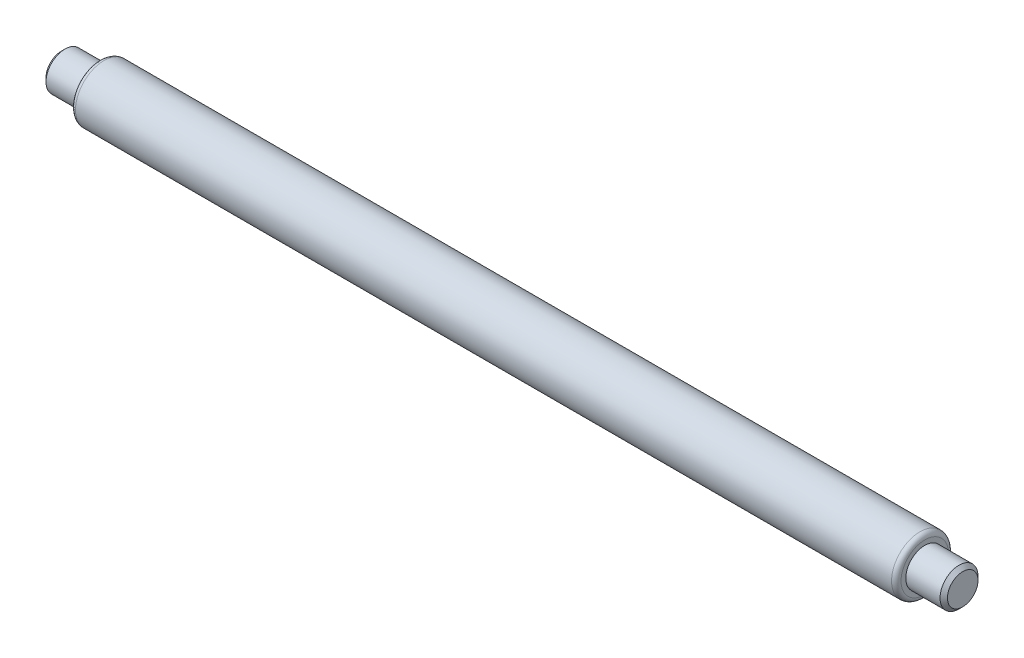
ISO-10303-21;
HEADER;
FILE_DESCRIPTION(('STEP AP214'),'2;1');
FILE_NAME('part.step','',(''),(''),'','','');
FILE_SCHEMA(('AUTOMOTIVE_DESIGN { 1 0 10303 214 1 1 1 1 }'));
ENDSEC;
DATA;
#1=APPLICATION_CONTEXT('core data for automotive mechanical design processes');
#2=APPLICATION_PROTOCOL_DEFINITION('international standard','automotive_design',2000,#1);
#3=PRODUCT_CONTEXT('',#1,'mechanical');
#4=PRODUCT('Part','Part','',(#3));
#5=PRODUCT_RELATED_PRODUCT_CATEGORY('part','',(#4));
#6=PRODUCT_DEFINITION_FORMATION('','',#4);
#7=PRODUCT_DEFINITION_CONTEXT('part definition',#1,'design');
#8=PRODUCT_DEFINITION('design','',#6,#7);
#9=PRODUCT_DEFINITION_SHAPE('','',#8);
#10=(LENGTH_UNIT() NAMED_UNIT(*) SI_UNIT(.MILLI.,.METRE.));
#11=(NAMED_UNIT(*) PLANE_ANGLE_UNIT() SI_UNIT($,.RADIAN.));
#12=(NAMED_UNIT(*) SI_UNIT($,.STERADIAN.) SOLID_ANGLE_UNIT());
#13=UNCERTAINTY_MEASURE_WITH_UNIT(LENGTH_MEASURE(1.E-05),#10,'distance_accuracy_value','');
#14=(GEOMETRIC_REPRESENTATION_CONTEXT(3) GLOBAL_UNCERTAINTY_ASSIGNED_CONTEXT((#13)) GLOBAL_UNIT_ASSIGNED_CONTEXT((#10,
#11,#12)) REPRESENTATION_CONTEXT('',''));
#15=CARTESIAN_POINT('',(0.,0.,0.));
#16=DIRECTION('',(0.,0.,1.));
#17=DIRECTION('',(1.,0.,0.));
#18=AXIS2_PLACEMENT_3D('',#15,#16,#17);
#19=CARTESIAN_POINT('',(-77.6451612903226,0.,0.));
#20=DIRECTION('',(-1.,0.,0.));
#21=DIRECTION('',(0.,0.,1.));
#22=AXIS2_PLACEMENT_3D('',#19,#20,#21);
#23=CYLINDRICAL_SURFACE('',#22,2.00000000000001);
#24=CARTESIAN_POINT('',(47.11,0.,0.));
#25=DIRECTION('',(-1.,0.,0.));
#26=DIRECTION('',(0.,0.,1.));
#27=AXIS2_PLACEMENT_3D('',#24,#25,#26);
#28=CIRCLE('',#27,2.);
#29=CARTESIAN_POINT('',(47.11,0.,2.));
#30=VERTEX_POINT('',#29);
#31=EDGE_CURVE('E85',#30,#30,#28,.T.);
#32=ORIENTED_EDGE('',*,*,#31,.T.);
#33=EDGE_LOOP('',(#32));
#34=FACE_BOUND('',#33,.T.);
#35=CARTESIAN_POINT('',(43.5,0.,0.));
#36=DIRECTION('',(-1.,0.,0.));
#37=DIRECTION('',(0.,0.,1.));
#38=AXIS2_PLACEMENT_3D('',#35,#36,#37);
#39=CIRCLE('',#38,2.00000000000001);
#40=CARTESIAN_POINT('',(43.5,0.,2.00000000000001));
#41=VERTEX_POINT('',#40);
#42=EDGE_CURVE('E69',#41,#41,#39,.T.);
#43=ORIENTED_EDGE('',*,*,#42,.F.);
#44=EDGE_LOOP('',(#43));
#45=FACE_BOUND('',#44,.T.);
#46=ADVANCED_FACE('F45',(#34,#45),#23,.T.);
#47=CARTESIAN_POINT('',(43.5,2.00000000000001,0.));
#48=DIRECTION('',(-1.,0.,0.));
#49=DIRECTION('',(0.,0.,1.));
#50=AXIS2_PLACEMENT_3D('',#47,#48,#49);
#51=PLANE('',#50);
#52=CARTESIAN_POINT('',(43.5,0.,0.));
#53=DIRECTION('',(-1.,0.,0.));
#54=DIRECTION('',(0.,0.,1.));
#55=AXIS2_PLACEMENT_3D('',#52,#53,#54);
#56=CIRCLE('',#55,2.5);
#57=CARTESIAN_POINT('',(43.5,0.,2.5));
#58=VERTEX_POINT('',#57);
#59=EDGE_CURVE('E10',#58,#58,#56,.F.);
#60=ORIENTED_EDGE('',*,*,#59,.T.);
#61=EDGE_LOOP('',(#60));
#62=FACE_BOUND('',#61,.T.);
#63=ORIENTED_EDGE('',*,*,#42,.T.);
#64=EDGE_LOOP('',(#63));
#65=FACE_BOUND('',#64,.T.);
#66=ADVANCED_FACE('F110',(#62,#65),#51,.F.);
#67=CARTESIAN_POINT('',(-77.6451612903226,0.,0.));
#68=DIRECTION('',(-1.,0.,0.));
#69=DIRECTION('',(0.,0.,1.));
#70=AXIS2_PLACEMENT_3D('',#67,#68,#69);
#71=CYLINDRICAL_SURFACE('',#70,3.);
#72=CARTESIAN_POINT('',(-43.,0.,0.));
#73=DIRECTION('',(1.,0.,0.));
#74=DIRECTION('',(0.,0.,-1.));
#75=AXIS2_PLACEMENT_3D('',#72,#73,#74);
#76=CIRCLE('',#75,3.);
#77=CARTESIAN_POINT('',(-43.,0.,-3.));
#78=VERTEX_POINT('',#77);
#79=EDGE_CURVE('E53',#78,#78,#76,.T.);
#80=ORIENTED_EDGE('',*,*,#79,.T.);
#81=EDGE_LOOP('',(#80));
#82=FACE_BOUND('',#81,.T.);
#83=CARTESIAN_POINT('',(43.,0.,0.));
#84=DIRECTION('',(-1.,0.,0.));
#85=DIRECTION('',(0.,0.,1.));
#86=AXIS2_PLACEMENT_3D('',#83,#84,#85);
#87=CIRCLE('',#86,3.);
#88=CARTESIAN_POINT('',(43.,0.,3.));
#89=VERTEX_POINT('',#88);
#90=EDGE_CURVE('E58',#89,#89,#87,.T.);
#91=ORIENTED_EDGE('',*,*,#90,.T.);
#92=EDGE_LOOP('',(#91));
#93=FACE_BOUND('',#92,.T.);
#94=ADVANCED_FACE('F115',(#82,#93),#71,.T.);
#95=CARTESIAN_POINT('',(-43.5,3.,0.));
#96=DIRECTION('',(1.,0.,0.));
#97=DIRECTION('',(0.,0.,-1.));
#98=AXIS2_PLACEMENT_3D('',#95,#96,#97);
#99=PLANE('',#98);
#100=CARTESIAN_POINT('',(-43.5,0.,0.));
#101=DIRECTION('',(1.,0.,0.));
#102=DIRECTION('',(0.,0.,-1.));
#103=AXIS2_PLACEMENT_3D('',#100,#101,#102);
#104=CIRCLE('',#103,2.5);
#105=CARTESIAN_POINT('',(-43.5,0.,-2.5));
#106=VERTEX_POINT('',#105);
#107=EDGE_CURVE('E63',#106,#106,#104,.F.);
#108=ORIENTED_EDGE('',*,*,#107,.T.);
#109=EDGE_LOOP('',(#108));
#110=FACE_BOUND('',#109,.T.);
#111=CARTESIAN_POINT('',(-43.5,0.,0.));
#112=DIRECTION('',(-1.,0.,0.));
#113=DIRECTION('',(0.,0.,1.));
#114=AXIS2_PLACEMENT_3D('',#111,#112,#113);
#115=CIRCLE('',#114,2.00000000000001);
#116=CARTESIAN_POINT('',(-43.5,0.,2.00000000000001));
#117=VERTEX_POINT('',#116);
#118=EDGE_CURVE('E73',#117,#117,#115,.T.);
#119=ORIENTED_EDGE('',*,*,#118,.F.);
#120=EDGE_LOOP('',(#119));
#121=FACE_BOUND('',#120,.T.);
#122=ADVANCED_FACE('F121',(#110,#121),#99,.F.);
#123=CARTESIAN_POINT('',(-77.6451612903226,0.,0.));
#124=DIRECTION('',(-1.,0.,0.));
#125=DIRECTION('',(0.,0.,1.));
#126=AXIS2_PLACEMENT_3D('',#123,#124,#125);
#127=CYLINDRICAL_SURFACE('',#126,2.00000000000001);
#128=CARTESIAN_POINT('',(-47.11,0.,0.));
#129=DIRECTION('',(1.,0.,0.));
#130=DIRECTION('',(0.,0.,-1.));
#131=AXIS2_PLACEMENT_3D('',#128,#129,#130);
#132=CIRCLE('',#131,2.);
#133=CARTESIAN_POINT('',(-47.11,0.,-2.));
#134=VERTEX_POINT('',#133);
#135=EDGE_CURVE('E77',#134,#134,#132,.T.);
#136=ORIENTED_EDGE('',*,*,#135,.T.);
#137=EDGE_LOOP('',(#136));
#138=FACE_BOUND('',#137,.T.);
#139=ORIENTED_EDGE('',*,*,#118,.T.);
#140=EDGE_LOOP('',(#139));
#141=FACE_BOUND('',#140,.T.);
#142=ADVANCED_FACE('F124',(#138,#141),#127,.T.);
#143=CARTESIAN_POINT('',(-47.5,0.,0.));
#144=DIRECTION('',(1.,0.,0.));
#145=DIRECTION('',(0.,0.,-1.));
#146=AXIS2_PLACEMENT_3D('',#143,#144,#145);
#147=CONICAL_SURFACE('',#146,1.61,0.785398163397449);
#148=ORIENTED_EDGE('',*,*,#135,.F.);
#149=EDGE_LOOP('',(#148));
#150=FACE_BOUND('',#149,.T.);
#151=CARTESIAN_POINT('',(-47.5,0.,0.));
#152=DIRECTION('',(1.,0.,0.));
#153=DIRECTION('',(0.,0.,-1.));
#154=AXIS2_PLACEMENT_3D('',#151,#152,#153);
#155=CIRCLE('',#154,1.61);
#156=CARTESIAN_POINT('',(-47.5,0.,-1.61));
#157=VERTEX_POINT('',#156);
#158=EDGE_CURVE('E81',#157,#157,#155,.T.);
#159=ORIENTED_EDGE('',*,*,#158,.T.);
#160=EDGE_LOOP('',(#159));
#161=FACE_BOUND('',#160,.T.);
#162=ADVANCED_FACE('F128',(#150,#161),#147,.T.);
#163=CARTESIAN_POINT('',(-47.5,2.00000000000001,0.));
#164=DIRECTION('',(1.,0.,0.));
#165=DIRECTION('',(0.,0.,-1.));
#166=AXIS2_PLACEMENT_3D('',#163,#164,#165);
#167=PLANE('',#166);
#168=ORIENTED_EDGE('',*,*,#158,.F.);
#169=EDGE_LOOP('',(#168));
#170=FACE_BOUND('',#169,.T.);
#171=ADVANCED_FACE('F105',(#170),#167,.F.);
#172=CARTESIAN_POINT('',(47.5,0.,0.));
#173=DIRECTION('',(-1.,0.,0.));
#174=DIRECTION('',(0.,0.,1.));
#175=AXIS2_PLACEMENT_3D('',#172,#173,#174);
#176=CONICAL_SURFACE('',#175,1.61,0.785398163397466);
#177=ORIENTED_EDGE('',*,*,#31,.F.);
#178=EDGE_LOOP('',(#177));
#179=FACE_BOUND('',#178,.T.);
#180=CARTESIAN_POINT('',(47.5,0.,0.));
#181=DIRECTION('',(-1.,0.,0.));
#182=DIRECTION('',(0.,0.,1.));
#183=AXIS2_PLACEMENT_3D('',#180,#181,#182);
#184=CIRCLE('',#183,1.61);
#185=CARTESIAN_POINT('',(47.5,0.,1.61));
#186=VERTEX_POINT('',#185);
#187=EDGE_CURVE('E89',#186,#186,#184,.T.);
#188=ORIENTED_EDGE('',*,*,#187,.T.);
#189=EDGE_LOOP('',(#188));
#190=FACE_BOUND('',#189,.T.);
#191=ADVANCED_FACE('F94',(#179,#190),#176,.T.);
#192=CARTESIAN_POINT('',(47.5,0.,0.));
#193=DIRECTION('',(-1.,0.,0.));
#194=DIRECTION('',(0.,0.,1.));
#195=AXIS2_PLACEMENT_3D('',#192,#193,#194);
#196=PLANE('',#195);
#197=ORIENTED_EDGE('',*,*,#187,.F.);
#198=EDGE_LOOP('',(#197));
#199=FACE_BOUND('',#198,.T.);
#200=ADVANCED_FACE('F96',(#199),#196,.F.);
#201=CARTESIAN_POINT('',(-43.,0.,0.));
#202=DIRECTION('',(1.,0.,0.));
#203=DIRECTION('',(0.,0.,-1.));
#204=AXIS2_PLACEMENT_3D('',#201,#202,#203);
#205=TOROIDAL_SURFACE('',#204,2.5,0.5);
#206=ORIENTED_EDGE('',*,*,#79,.F.);
#207=EDGE_LOOP('',(#206));
#208=FACE_BOUND('',#207,.T.);
#209=ORIENTED_EDGE('',*,*,#107,.F.);
#210=EDGE_LOOP('',(#209));
#211=FACE_BOUND('',#210,.T.);
#212=ADVANCED_FACE('F98',(#208,#211),#205,.T.);
#213=CARTESIAN_POINT('',(43.,0.,0.));
#214=DIRECTION('',(-1.,0.,0.));
#215=DIRECTION('',(0.,0.,1.));
#216=AXIS2_PLACEMENT_3D('',#213,#214,#215);
#217=TOROIDAL_SURFACE('',#216,2.5,0.5);
#218=ORIENTED_EDGE('',*,*,#59,.F.);
#219=EDGE_LOOP('',(#218));
#220=FACE_BOUND('',#219,.T.);
#221=ORIENTED_EDGE('',*,*,#90,.F.);
#222=EDGE_LOOP('',(#221));
#223=FACE_BOUND('',#222,.T.);
#224=ADVANCED_FACE('F47',(#220,#223),#217,.T.);
#225=CLOSED_SHELL('',(#46,#66,#94,#122,#142,#162,#171,#191,#200,#212,#224));
#226=MANIFOLD_SOLID_BREP('B2',#225);
#227=ADVANCED_BREP_SHAPE_REPRESENTATION('',(#18,#226),#14);
#228=SHAPE_DEFINITION_REPRESENTATION(#9,#227);
ENDSEC;
END-ISO-10303-21;
